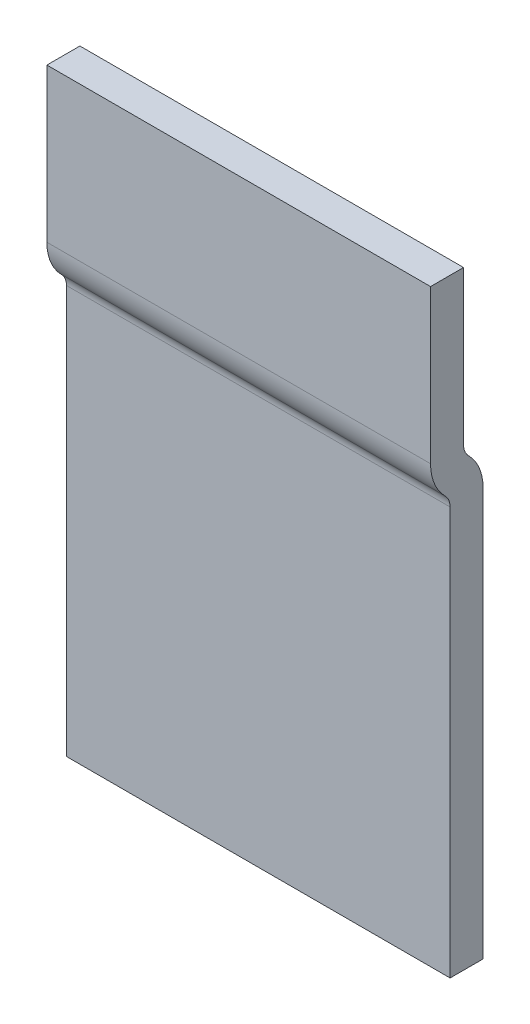
ISO-10303-21;
HEADER;
FILE_DESCRIPTION(('STEP AP214'),'2;1');
FILE_NAME('part.step','',(''),(''),'','','');
FILE_SCHEMA(('AUTOMOTIVE_DESIGN { 1 0 10303 214 1 1 1 1 }'));
ENDSEC;
DATA;
#1=APPLICATION_CONTEXT('core data for automotive mechanical design processes');
#2=APPLICATION_PROTOCOL_DEFINITION('international standard','automotive_design',2000,#1);
#3=PRODUCT_CONTEXT('',#1,'mechanical');
#4=PRODUCT('Part','Part','',(#3));
#5=PRODUCT_RELATED_PRODUCT_CATEGORY('part','',(#4));
#6=PRODUCT_DEFINITION_FORMATION('','',#4);
#7=PRODUCT_DEFINITION_CONTEXT('part definition',#1,'design');
#8=PRODUCT_DEFINITION('design','',#6,#7);
#9=PRODUCT_DEFINITION_SHAPE('','',#8);
#10=(LENGTH_UNIT() NAMED_UNIT(*) SI_UNIT(.MILLI.,.METRE.));
#11=(NAMED_UNIT(*) PLANE_ANGLE_UNIT() SI_UNIT($,.RADIAN.));
#12=(NAMED_UNIT(*) SI_UNIT($,.STERADIAN.) SOLID_ANGLE_UNIT());
#13=UNCERTAINTY_MEASURE_WITH_UNIT(LENGTH_MEASURE(1.E-05),#10,'distance_accuracy_value','');
#14=(GEOMETRIC_REPRESENTATION_CONTEXT(3) GLOBAL_UNCERTAINTY_ASSIGNED_CONTEXT((#13)) GLOBAL_UNIT_ASSIGNED_CONTEXT((#10,
#11,#12)) REPRESENTATION_CONTEXT('',''));
#15=CARTESIAN_POINT('',(0.,0.,0.));
#16=DIRECTION('',(0.,0.,1.));
#17=DIRECTION('',(1.,0.,0.));
#18=AXIS2_PLACEMENT_3D('',#15,#16,#17);
#19=CARTESIAN_POINT('',(2.5,-0.0681623922351563,0.685000000000001));
#20=DIRECTION('',(0.,0.,-1.));
#21=DIRECTION('',(0.,1.,0.));
#22=AXIS2_PLACEMENT_3D('',#19,#20,#21);
#23=PLANE('',#22);
#24=DIRECTION('',(0.,-1.,0.));
#25=VECTOR('',#24,1.);
#26=CARTESIAN_POINT('',(-2.5,-0.0681623922351563,0.685000000000001));
#27=LINE('',#26,#25);
#28=CARTESIAN_POINT('',(-2.5,7.93183760776485,0.684999999999998));
#29=VERTEX_POINT('',#28);
#30=CARTESIAN_POINT('',(-2.5,5.93183760776485,0.684999999999998));
#31=VERTEX_POINT('',#30);
#32=EDGE_CURVE('E13',#29,#31,#27,.T.);
#33=ORIENTED_EDGE('',*,*,#32,.T.);
#34=DIRECTION('',(1.,0.,0.));
#35=VECTOR('',#34,1.);
#36=CARTESIAN_POINT('',(2.5,5.93183760776485,0.684999999999998));
#37=LINE('',#36,#35);
#38=CARTESIAN_POINT('',(2.5,5.93183760776485,0.684999999999998));
#39=VERTEX_POINT('',#38);
#40=EDGE_CURVE('E161',#31,#39,#37,.T.);
#41=ORIENTED_EDGE('',*,*,#40,.T.);
#42=DIRECTION('',(0.,-1.,0.));
#43=VECTOR('',#42,1.);
#44=CARTESIAN_POINT('',(2.5,-0.0681623922351563,0.685000000000001));
#45=LINE('',#44,#43);
#46=CARTESIAN_POINT('',(2.5,7.93183760776485,0.684999999999998));
#47=VERTEX_POINT('',#46);
#48=EDGE_CURVE('E305',#47,#39,#45,.T.);
#49=ORIENTED_EDGE('',*,*,#48,.F.);
#50=DIRECTION('',(-1.,0.,0.));
#51=VECTOR('',#50,1.);
#52=CARTESIAN_POINT('',(2.5,7.93183760776484,0.684999999999997));
#53=LINE('',#52,#51);
#54=EDGE_CURVE('E327',#47,#29,#53,.T.);
#55=ORIENTED_EDGE('',*,*,#54,.T.);
#56=EDGE_LOOP('',(#33,#41,#49,#55));
#57=FACE_BOUND('',#56,.T.);
#58=ADVANCED_FACE('F151',(#57),#23,.F.);
#59=CARTESIAN_POINT('',(2.5,-0.0681623922351563,0.255000000000001));
#60=DIRECTION('',(0.,0.,1.));
#61=DIRECTION('',(1.,0.,0.));
#62=AXIS2_PLACEMENT_3D('',#59,#60,#61);
#63=PLANE('',#62);
#64=DIRECTION('',(0.,1.,0.));
#65=VECTOR('',#64,1.);
#66=CARTESIAN_POINT('',(2.5,-0.0681623922351563,0.255000000000001));
#67=LINE('',#66,#65);
#68=CARTESIAN_POINT('',(2.5,5.93183760776485,0.255000000000001));
#69=VERTEX_POINT('',#68);
#70=CARTESIAN_POINT('',(2.5,7.93183760776485,0.255000000000001));
#71=VERTEX_POINT('',#70);
#72=EDGE_CURVE('E299',#69,#71,#67,.T.);
#73=ORIENTED_EDGE('',*,*,#72,.F.);
#74=DIRECTION('',(-1.,0.,0.));
#75=VECTOR('',#74,1.);
#76=CARTESIAN_POINT('',(2.5,5.93183760776485,0.255000000000001));
#77=LINE('',#76,#75);
#78=CARTESIAN_POINT('',(-2.5,5.93183760776485,0.255000000000001));
#79=VERTEX_POINT('',#78);
#80=EDGE_CURVE('E325',#69,#79,#77,.T.);
#81=ORIENTED_EDGE('',*,*,#80,.T.);
#82=DIRECTION('',(0.,1.,0.));
#83=VECTOR('',#82,1.);
#84=CARTESIAN_POINT('',(-2.5,-0.0681623922351563,0.255000000000001));
#85=LINE('',#84,#83);
#86=CARTESIAN_POINT('',(-2.5,7.93183760776485,0.255000000000001));
#87=VERTEX_POINT('',#86);
#88=EDGE_CURVE('E312',#79,#87,#85,.T.);
#89=ORIENTED_EDGE('',*,*,#88,.T.);
#90=DIRECTION('',(-1.,0.,0.));
#91=VECTOR('',#90,1.);
#92=CARTESIAN_POINT('',(2.5,7.93183760776484,0.255000000000001));
#93=LINE('',#92,#91);
#94=EDGE_CURVE('E279',#71,#87,#93,.T.);
#95=ORIENTED_EDGE('',*,*,#94,.F.);
#96=EDGE_LOOP('',(#73,#81,#89,#95));
#97=FACE_BOUND('',#96,.T.);
#98=ADVANCED_FACE('F359',(#97),#63,.F.);
#99=CARTESIAN_POINT('',(2.5,2.98326268928114,2.98326268928114));
#100=DIRECTION('',(1.,0.,0.));
#101=DIRECTION('',(0.,0.,-1.));
#102=AXIS2_PLACEMENT_3D('',#99,#100,#101);
#103=PLANE('',#102);
#104=CARTESIAN_POINT('',(2.5,5.93183760776485,0.03468777079743));
#105=DIRECTION('',(1.,0.,0.));
#106=DIRECTION('',(0.,0.,-1.));
#107=AXIS2_PLACEMENT_3D('',#104,#105,#106);
#108=CIRCLE('',#107,0.220312229202571);
#109=CARTESIAN_POINT('',(2.5,5.77605333651738,0.190472042044892));
#110=VERTEX_POINT('',#109);
#111=EDGE_CURVE('E310',#110,#69,#108,.F.);
#112=ORIENTED_EDGE('',*,*,#111,.T.);
#113=ORIENTED_EDGE('',*,*,#72,.T.);
#114=DIRECTION('',(0.,0.,1.));
#115=VECTOR('',#114,1.);
#116=CARTESIAN_POINT('',(2.5,7.93183760776484,0.255000000000001));
#117=LINE('',#116,#115);
#118=EDGE_CURVE('E303',#71,#47,#117,.T.);
#119=ORIENTED_EDGE('',*,*,#118,.T.);
#120=ORIENTED_EDGE('',*,*,#48,.T.);
#121=CARTESIAN_POINT('',(2.5,5.93183760776485,0.03468777079743));
#122=DIRECTION('',(1.,0.,0.));
#123=DIRECTION('',(0.,0.,-1.));
#124=AXIS2_PLACEMENT_3D('',#121,#122,#123);
#125=CIRCLE('',#124,0.650312229202567);
#126=CARTESIAN_POINT('',(2.5,5.47199742060717,0.494527957955105));
#127=VERTEX_POINT('',#126);
#128=EDGE_CURVE('E313',#39,#127,#125,.T.);
#129=ORIENTED_EDGE('',*,*,#128,.T.);
#130=CARTESIAN_POINT('',(2.5,5.31621314935971,0.650312229202565));
#131=DIRECTION('',(-1.,0.,0.));
#132=DIRECTION('',(0.,0.,-1.));
#133=AXIS2_PLACEMENT_3D('',#130,#131,#132);
#134=CIRCLE('',#133,0.220312229202567);
#135=CARTESIAN_POINT('',(2.5,5.31621314935971,0.429999999999997));
#136=VERTEX_POINT('',#135);
#137=EDGE_CURVE('E237',#127,#136,#134,.T.);
#138=ORIENTED_EDGE('',*,*,#137,.T.);
#139=DIRECTION('',(0.,-1.,0.));
#140=VECTOR('',#139,1.);
#141=CARTESIAN_POINT('',(2.5,0.,0.43));
#142=LINE('',#141,#140);
#143=CARTESIAN_POINT('',(2.5,0.,0.43));
#144=VERTEX_POINT('',#143);
#145=EDGE_CURVE('E225',#136,#144,#142,.T.);
#146=ORIENTED_EDGE('',*,*,#145,.T.);
#147=DIRECTION('',(0.,0.,-1.));
#148=VECTOR('',#147,1.);
#149=CARTESIAN_POINT('',(2.5,0.,0.));
#150=LINE('',#149,#148);
#151=CARTESIAN_POINT('',(2.5,0.,0.));
#152=VERTEX_POINT('',#151);
#153=EDGE_CURVE('E332',#144,#152,#150,.T.);
#154=ORIENTED_EDGE('',*,*,#153,.T.);
#155=DIRECTION('',(0.,1.,0.));
#156=VECTOR('',#155,1.);
#157=CARTESIAN_POINT('',(2.5,0.,0.));
#158=LINE('',#157,#156);
#159=CARTESIAN_POINT('',(2.5,5.31621314935971,0.));
#160=VERTEX_POINT('',#159);
#161=EDGE_CURVE('E302',#152,#160,#158,.T.);
#162=ORIENTED_EDGE('',*,*,#161,.T.);
#163=CARTESIAN_POINT('',(2.5,5.31621314935971,0.650312229202565));
#164=DIRECTION('',(1.,0.,0.));
#165=DIRECTION('',(0.,0.,-1.));
#166=AXIS2_PLACEMENT_3D('',#163,#164,#165);
#167=CIRCLE('',#166,0.650312229202565);
#168=EDGE_CURVE('E314',#160,#110,#167,.T.);
#169=ORIENTED_EDGE('',*,*,#168,.T.);
#170=EDGE_LOOP('',(#112,#113,#119,#120,#129,#138,#146,#154,#162,#169));
#171=FACE_BOUND('',#170,.T.);
#172=ADVANCED_FACE('F340',(#171),#103,.T.);
#173=CARTESIAN_POINT('',(-2.5,-0.0681623922351563,0.255000000000001));
#174=DIRECTION('',(1.,0.,0.));
#175=DIRECTION('',(0.,0.,-1.));
#176=AXIS2_PLACEMENT_3D('',#173,#174,#175);
#177=PLANE('',#176);
#178=ORIENTED_EDGE('',*,*,#88,.F.);
#179=CARTESIAN_POINT('',(-2.5,5.93183760776485,0.03468777079743));
#180=DIRECTION('',(1.,0.,0.));
#181=DIRECTION('',(0.,0.,-1.));
#182=AXIS2_PLACEMENT_3D('',#179,#180,#181);
#183=CIRCLE('',#182,0.220312229202571);
#184=CARTESIAN_POINT('',(-2.5,5.77605333651738,0.190472042044892));
#185=VERTEX_POINT('',#184);
#186=EDGE_CURVE('E244',#185,#79,#183,.F.);
#187=ORIENTED_EDGE('',*,*,#186,.F.);
#188=CARTESIAN_POINT('',(-2.5,5.31621314935971,0.650312229202565));
#189=DIRECTION('',(1.,0.,0.));
#190=DIRECTION('',(0.,0.,-1.));
#191=AXIS2_PLACEMENT_3D('',#188,#189,#190);
#192=CIRCLE('',#191,0.650312229202565);
#193=CARTESIAN_POINT('',(-2.5,5.31621314935971,0.));
#194=VERTEX_POINT('',#193);
#195=EDGE_CURVE('E261',#194,#185,#192,.T.);
#196=ORIENTED_EDGE('',*,*,#195,.F.);
#197=DIRECTION('',(0.,1.,0.));
#198=VECTOR('',#197,1.);
#199=CARTESIAN_POINT('',(-2.5,0.,0.));
#200=LINE('',#199,#198);
#201=CARTESIAN_POINT('',(-2.5,0.,0.));
#202=VERTEX_POINT('',#201);
#203=EDGE_CURVE('E269',#202,#194,#200,.T.);
#204=ORIENTED_EDGE('',*,*,#203,.F.);
#205=DIRECTION('',(0.,0.,-1.));
#206=VECTOR('',#205,1.);
#207=CARTESIAN_POINT('',(-2.5,0.,0.));
#208=LINE('',#207,#206);
#209=CARTESIAN_POINT('',(-2.5,0.,0.43));
#210=VERTEX_POINT('',#209);
#211=EDGE_CURVE('E287',#210,#202,#208,.T.);
#212=ORIENTED_EDGE('',*,*,#211,.F.);
#213=DIRECTION('',(0.,-1.,0.));
#214=VECTOR('',#213,1.);
#215=CARTESIAN_POINT('',(-2.5,0.,0.43));
#216=LINE('',#215,#214);
#217=CARTESIAN_POINT('',(-2.5,5.31621314935971,0.429999999999997));
#218=VERTEX_POINT('',#217);
#219=EDGE_CURVE('E248',#218,#210,#216,.T.);
#220=ORIENTED_EDGE('',*,*,#219,.F.);
#221=CARTESIAN_POINT('',(-2.5,5.31621314935971,0.650312229202565));
#222=DIRECTION('',(-1.,0.,0.));
#223=DIRECTION('',(0.,0.,-1.));
#224=AXIS2_PLACEMENT_3D('',#221,#222,#223);
#225=CIRCLE('',#224,0.220312229202567);
#226=CARTESIAN_POINT('',(-2.5,5.47199742060717,0.494527957955105));
#227=VERTEX_POINT('',#226);
#228=EDGE_CURVE('E235',#227,#218,#225,.T.);
#229=ORIENTED_EDGE('',*,*,#228,.F.);
#230=CARTESIAN_POINT('',(-2.5,5.93183760776485,0.03468777079743));
#231=DIRECTION('',(1.,0.,0.));
#232=DIRECTION('',(0.,0.,-1.));
#233=AXIS2_PLACEMENT_3D('',#230,#231,#232);
#234=CIRCLE('',#233,0.650312229202567);
#235=EDGE_CURVE('E155',#31,#227,#234,.T.);
#236=ORIENTED_EDGE('',*,*,#235,.F.);
#237=ORIENTED_EDGE('',*,*,#32,.F.);
#238=DIRECTION('',(0.,0.,1.));
#239=VECTOR('',#238,1.);
#240=CARTESIAN_POINT('',(-2.5,7.93183760776484,0.255000000000001));
#241=LINE('',#240,#239);
#242=EDGE_CURVE('E274',#87,#29,#241,.T.);
#243=ORIENTED_EDGE('',*,*,#242,.F.);
#244=EDGE_LOOP('',(#178,#187,#196,#204,#212,#220,#229,#236,#237,#243));
#245=FACE_BOUND('',#244,.T.);
#246=ADVANCED_FACE('F246',(#245),#177,.F.);
#247=CARTESIAN_POINT('',(-2.50000000050932,5.93183760776485,0.03468777079743));
#248=DIRECTION('',(1.,0.,0.));
#249=DIRECTION('',(0.,0.707106781186547,0.707106781186548));
#250=AXIS2_PLACEMENT_3D('',#247,#248,#249);
#251=CYLINDRICAL_SURFACE('',#250,0.220312229202571);
#252=ORIENTED_EDGE('',*,*,#80,.F.);
#253=ORIENTED_EDGE('',*,*,#111,.F.);
#254=DIRECTION('',(-1.,0.,0.));
#255=VECTOR('',#254,1.);
#256=CARTESIAN_POINT('',(2.5,5.77605333651738,0.190472042044892));
#257=LINE('',#256,#255);
#258=EDGE_CURVE('E309',#110,#185,#257,.T.);
#259=ORIENTED_EDGE('',*,*,#258,.T.);
#260=ORIENTED_EDGE('',*,*,#186,.T.);
#261=EDGE_LOOP('',(#252,#253,#259,#260));
#262=FACE_BOUND('',#261,.T.);
#263=ADVANCED_FACE('F360',(#262),#251,.F.);
#264=CARTESIAN_POINT('',(-2.50000000050932,5.93183760776485,0.03468777079743));
#265=DIRECTION('',(1.,0.,0.));
#266=DIRECTION('',(0.,0.707106781186547,0.707106781186548));
#267=AXIS2_PLACEMENT_3D('',#264,#265,#266);
#268=CYLINDRICAL_SURFACE('',#267,0.650312229202567);
#269=ORIENTED_EDGE('',*,*,#40,.F.);
#270=ORIENTED_EDGE('',*,*,#235,.T.);
#271=DIRECTION('',(1.,0.,0.));
#272=VECTOR('',#271,1.);
#273=CARTESIAN_POINT('',(2.5,5.47199742060717,0.494527957955105));
#274=LINE('',#273,#272);
#275=EDGE_CURVE('E231',#227,#127,#274,.T.);
#276=ORIENTED_EDGE('',*,*,#275,.T.);
#277=ORIENTED_EDGE('',*,*,#128,.F.);
#278=EDGE_LOOP('',(#269,#270,#276,#277));
#279=FACE_BOUND('',#278,.T.);
#280=ADVANCED_FACE('F241',(#279),#268,.T.);
#281=CARTESIAN_POINT('',(-2.50000000050932,5.31621314935971,0.650312229202565));
#282=DIRECTION('',(1.,0.,0.));
#283=DIRECTION('',(0.,1.,0.));
#284=AXIS2_PLACEMENT_3D('',#281,#282,#283);
#285=CYLINDRICAL_SURFACE('',#284,0.220312229202567);
#286=ORIENTED_EDGE('',*,*,#275,.F.);
#287=ORIENTED_EDGE('',*,*,#228,.T.);
#288=DIRECTION('',(1.,0.,0.));
#289=VECTOR('',#288,1.);
#290=CARTESIAN_POINT('',(2.5,5.31621314935971,0.429999999999997));
#291=LINE('',#290,#289);
#292=EDGE_CURVE('E249',#218,#136,#291,.T.);
#293=ORIENTED_EDGE('',*,*,#292,.T.);
#294=ORIENTED_EDGE('',*,*,#137,.F.);
#295=EDGE_LOOP('',(#286,#287,#293,#294));
#296=FACE_BOUND('',#295,.T.);
#297=ADVANCED_FACE('F232',(#296),#285,.F.);
#298=CARTESIAN_POINT('',(-2.50000000050932,5.31621314935971,0.650312229202565));
#299=DIRECTION('',(1.,0.,0.));
#300=DIRECTION('',(0.,1.,0.));
#301=AXIS2_PLACEMENT_3D('',#298,#299,#300);
#302=CYLINDRICAL_SURFACE('',#301,0.650312229202565);
#303=ORIENTED_EDGE('',*,*,#258,.F.);
#304=ORIENTED_EDGE('',*,*,#168,.F.);
#305=DIRECTION('',(-1.,0.,0.));
#306=VECTOR('',#305,1.);
#307=CARTESIAN_POINT('',(2.5,5.31621314935971,0.));
#308=LINE('',#307,#306);
#309=EDGE_CURVE('E251',#160,#194,#308,.T.);
#310=ORIENTED_EDGE('',*,*,#309,.T.);
#311=ORIENTED_EDGE('',*,*,#195,.T.);
#312=EDGE_LOOP('',(#303,#304,#310,#311));
#313=FACE_BOUND('',#312,.T.);
#314=ADVANCED_FACE('F348',(#313),#302,.T.);
#315=CARTESIAN_POINT('',(2.5,0.,0.));
#316=DIRECTION('',(0.,0.,1.));
#317=DIRECTION('',(1.,0.,0.));
#318=AXIS2_PLACEMENT_3D('',#315,#316,#317);
#319=PLANE('',#318);
#320=ORIENTED_EDGE('',*,*,#309,.F.);
#321=ORIENTED_EDGE('',*,*,#161,.F.);
#322=DIRECTION('',(-1.,0.,0.));
#323=VECTOR('',#322,1.);
#324=CARTESIAN_POINT('',(2.5,0.,0.));
#325=LINE('',#324,#323);
#326=EDGE_CURVE('E266',#152,#202,#325,.T.);
#327=ORIENTED_EDGE('',*,*,#326,.T.);
#328=ORIENTED_EDGE('',*,*,#203,.T.);
#329=EDGE_LOOP('',(#320,#321,#327,#328));
#330=FACE_BOUND('',#329,.T.);
#331=ADVANCED_FACE('F346',(#330),#319,.F.);
#332=CARTESIAN_POINT('',(2.5,7.93183760776484,0.255000000000001));
#333=DIRECTION('',(0.,-1.,0.));
#334=DIRECTION('',(0.,0.,-1.));
#335=AXIS2_PLACEMENT_3D('',#332,#333,#334);
#336=PLANE('',#335);
#337=ORIENTED_EDGE('',*,*,#242,.T.);
#338=ORIENTED_EDGE('',*,*,#54,.F.);
#339=ORIENTED_EDGE('',*,*,#118,.F.);
#340=ORIENTED_EDGE('',*,*,#94,.T.);
#341=EDGE_LOOP('',(#337,#338,#339,#340));
#342=FACE_BOUND('',#341,.T.);
#343=ADVANCED_FACE('F357',(#342),#336,.F.);
#344=CARTESIAN_POINT('',(2.5,0.,0.43));
#345=DIRECTION('',(0.,0.,-1.));
#346=DIRECTION('',(0.,1.,0.));
#347=AXIS2_PLACEMENT_3D('',#344,#345,#346);
#348=PLANE('',#347);
#349=ORIENTED_EDGE('',*,*,#292,.F.);
#350=ORIENTED_EDGE('',*,*,#219,.T.);
#351=DIRECTION('',(-1.,0.,0.));
#352=VECTOR('',#351,1.);
#353=CARTESIAN_POINT('',(2.5,0.,0.43));
#354=LINE('',#353,#352);
#355=EDGE_CURVE('E292',#144,#210,#354,.T.);
#356=ORIENTED_EDGE('',*,*,#355,.F.);
#357=ORIENTED_EDGE('',*,*,#145,.F.);
#358=EDGE_LOOP('',(#349,#350,#356,#357));
#359=FACE_BOUND('',#358,.T.);
#360=ADVANCED_FACE('F441',(#359),#348,.F.);
#361=CARTESIAN_POINT('',(2.5,0.,0.));
#362=DIRECTION('',(0.,1.,0.));
#363=DIRECTION('',(0.,0.,1.));
#364=AXIS2_PLACEMENT_3D('',#361,#362,#363);
#365=PLANE('',#364);
#366=ORIENTED_EDGE('',*,*,#211,.T.);
#367=ORIENTED_EDGE('',*,*,#326,.F.);
#368=ORIENTED_EDGE('',*,*,#153,.F.);
#369=ORIENTED_EDGE('',*,*,#355,.T.);
#370=EDGE_LOOP('',(#366,#367,#368,#369));
#371=FACE_BOUND('',#370,.T.);
#372=ADVANCED_FACE('F153',(#371),#365,.F.);
#373=CLOSED_SHELL('',(#58,#98,#172,#246,#263,#280,#297,#314,#331,#343,#360,#372));
#374=MANIFOLD_SOLID_BREP('B2',#373);
#375=ADVANCED_BREP_SHAPE_REPRESENTATION('',(#18,#374),#14);
#376=SHAPE_DEFINITION_REPRESENTATION(#9,#375);
ENDSEC;
END-ISO-10303-21;
